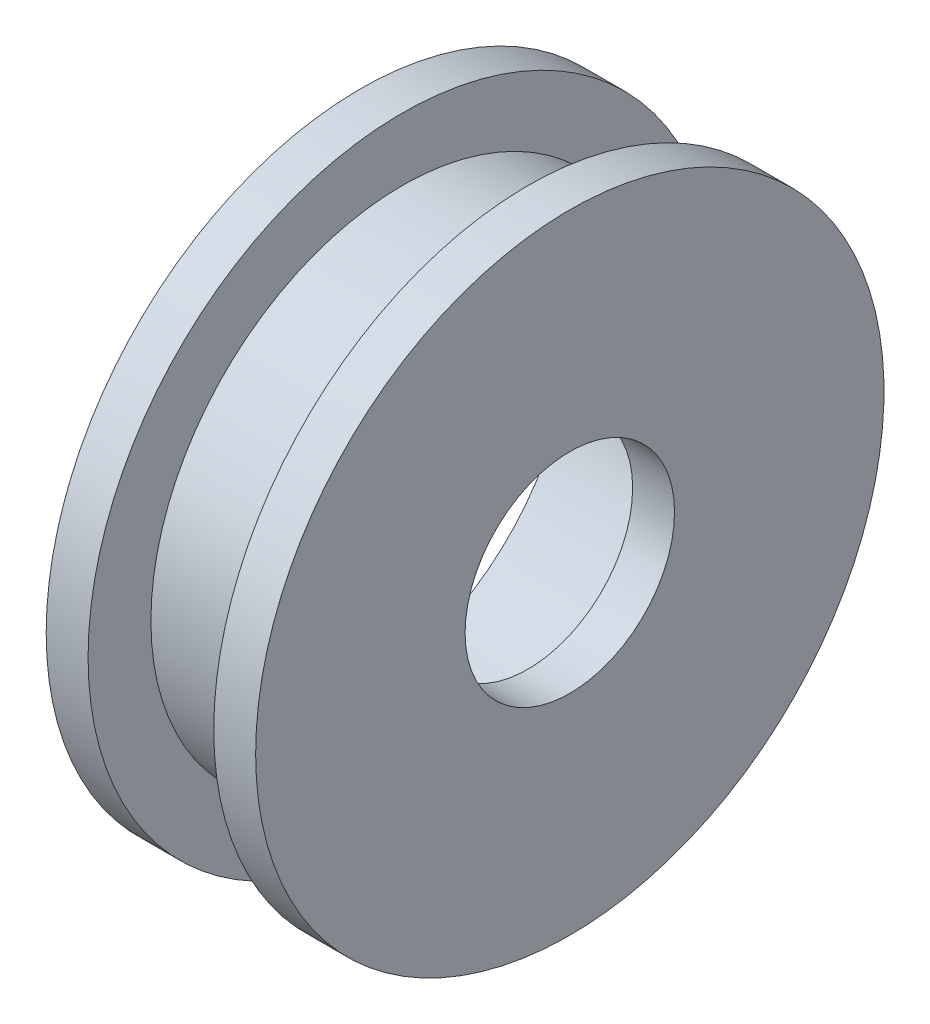
ISO-10303-21;
HEADER;
FILE_DESCRIPTION(('STEP AP214'),'2;1');
FILE_NAME('part.step','',(''),(''),'','','');
FILE_SCHEMA(('AUTOMOTIVE_DESIGN { 1 0 10303 214 1 1 1 1 }'));
ENDSEC;
DATA;
#1=APPLICATION_CONTEXT('core data for automotive mechanical design processes');
#2=APPLICATION_PROTOCOL_DEFINITION('international standard','automotive_design',2000,#1);
#3=PRODUCT_CONTEXT('',#1,'mechanical');
#4=PRODUCT('Part','Part','',(#3));
#5=PRODUCT_RELATED_PRODUCT_CATEGORY('part','',(#4));
#6=PRODUCT_DEFINITION_FORMATION('','',#4);
#7=PRODUCT_DEFINITION_CONTEXT('part definition',#1,'design');
#8=PRODUCT_DEFINITION('design','',#6,#7);
#9=PRODUCT_DEFINITION_SHAPE('','',#8);
#10=(LENGTH_UNIT() NAMED_UNIT(*) SI_UNIT(.MILLI.,.METRE.));
#11=(NAMED_UNIT(*) PLANE_ANGLE_UNIT() SI_UNIT($,.RADIAN.));
#12=(NAMED_UNIT(*) SI_UNIT($,.STERADIAN.) SOLID_ANGLE_UNIT());
#13=UNCERTAINTY_MEASURE_WITH_UNIT(LENGTH_MEASURE(1.E-05),#10,'distance_accuracy_value','');
#14=(GEOMETRIC_REPRESENTATION_CONTEXT(3) GLOBAL_UNCERTAINTY_ASSIGNED_CONTEXT((#13)) GLOBAL_UNIT_ASSIGNED_CONTEXT((#10,
#11,#12)) REPRESENTATION_CONTEXT('',''));
#15=CARTESIAN_POINT('',(0.,0.,0.));
#16=DIRECTION('',(0.,0.,1.));
#17=DIRECTION('',(1.,0.,0.));
#18=AXIS2_PLACEMENT_3D('',#15,#16,#17);
#19=CARTESIAN_POINT('',(0.,0.,0.));
#20=DIRECTION('',(-1.,0.,0.));
#21=DIRECTION('',(0.,0.,1.));
#22=AXIS2_PLACEMENT_3D('',#19,#20,#21);
#23=CYLINDRICAL_SURFACE('',#22,7.5);
#24=CARTESIAN_POINT('',(-4.,0.,0.));
#25=DIRECTION('',(-1.,0.,0.));
#26=DIRECTION('',(0.,0.,1.));
#27=AXIS2_PLACEMENT_3D('',#24,#25,#26);
#28=CIRCLE('',#27,7.5);
#29=CARTESIAN_POINT('',(-4.,0.,7.5));
#30=VERTEX_POINT('',#29);
#31=EDGE_CURVE('E10',#30,#30,#28,.T.);
#32=ORIENTED_EDGE('',*,*,#31,.T.);
#33=EDGE_LOOP('',(#32));
#34=FACE_BOUND('',#33,.T.);
#35=CARTESIAN_POINT('',(-5.,0.,0.));
#36=DIRECTION('',(-1.,0.,0.));
#37=DIRECTION('',(0.,0.,1.));
#38=AXIS2_PLACEMENT_3D('',#35,#36,#37);
#39=CIRCLE('',#38,7.5);
#40=CARTESIAN_POINT('',(-5.,0.,7.5));
#41=VERTEX_POINT('',#40);
#42=EDGE_CURVE('E65',#41,#41,#39,.T.);
#43=ORIENTED_EDGE('',*,*,#42,.F.);
#44=EDGE_LOOP('',(#43));
#45=FACE_BOUND('',#44,.T.);
#46=ADVANCED_FACE('F31',(#34,#45),#23,.T.);
#47=CARTESIAN_POINT('',(-4.,-7.5,0.));
#48=DIRECTION('',(1.,0.,0.));
#49=DIRECTION('',(0.,0.,-1.));
#50=AXIS2_PLACEMENT_3D('',#47,#48,#49);
#51=PLANE('',#50);
#52=CARTESIAN_POINT('',(-4.00000000000001,0.,0.));
#53=DIRECTION('',(-1.,0.,0.));
#54=DIRECTION('',(0.,0.,1.));
#55=AXIS2_PLACEMENT_3D('',#52,#53,#54);
#56=CIRCLE('',#55,6.);
#57=CARTESIAN_POINT('',(-4.00000000000001,0.,6.));
#58=VERTEX_POINT('',#57);
#59=EDGE_CURVE('E37',#58,#58,#56,.T.);
#60=ORIENTED_EDGE('',*,*,#59,.T.);
#61=EDGE_LOOP('',(#60));
#62=FACE_BOUND('',#61,.T.);
#63=ORIENTED_EDGE('',*,*,#31,.F.);
#64=EDGE_LOOP('',(#63));
#65=FACE_BOUND('',#64,.T.);
#66=ADVANCED_FACE('F73',(#62,#65),#51,.T.);
#67=CARTESIAN_POINT('',(0.,0.,0.));
#68=DIRECTION('',(-1.,0.,0.));
#69=DIRECTION('',(0.,0.,1.));
#70=AXIS2_PLACEMENT_3D('',#67,#68,#69);
#71=CYLINDRICAL_SURFACE('',#70,6.);
#72=CARTESIAN_POINT('',(-1.,0.,0.));
#73=DIRECTION('',(-1.,0.,0.));
#74=DIRECTION('',(0.,0.,1.));
#75=AXIS2_PLACEMENT_3D('',#72,#73,#74);
#76=CIRCLE('',#75,6.);
#77=CARTESIAN_POINT('',(-1.,0.,6.));
#78=VERTEX_POINT('',#77);
#79=EDGE_CURVE('E41',#78,#78,#76,.T.);
#80=ORIENTED_EDGE('',*,*,#79,.T.);
#81=EDGE_LOOP('',(#80));
#82=FACE_BOUND('',#81,.T.);
#83=ORIENTED_EDGE('',*,*,#59,.F.);
#84=EDGE_LOOP('',(#83));
#85=FACE_BOUND('',#84,.T.);
#86=ADVANCED_FACE('F77',(#82,#85),#71,.T.);
#87=CARTESIAN_POINT('',(-1.,-6.,0.));
#88=DIRECTION('',(-1.,0.,0.));
#89=DIRECTION('',(0.,0.,1.));
#90=AXIS2_PLACEMENT_3D('',#87,#88,#89);
#91=PLANE('',#90);
#92=CARTESIAN_POINT('',(-1.,0.,0.));
#93=DIRECTION('',(-1.,0.,0.));
#94=DIRECTION('',(0.,0.,1.));
#95=AXIS2_PLACEMENT_3D('',#92,#93,#94);
#96=CIRCLE('',#95,7.5);
#97=CARTESIAN_POINT('',(-1.,0.,7.5));
#98=VERTEX_POINT('',#97);
#99=EDGE_CURVE('E45',#98,#98,#96,.T.);
#100=ORIENTED_EDGE('',*,*,#99,.T.);
#101=EDGE_LOOP('',(#100));
#102=FACE_BOUND('',#101,.T.);
#103=ORIENTED_EDGE('',*,*,#79,.F.);
#104=EDGE_LOOP('',(#103));
#105=FACE_BOUND('',#104,.T.);
#106=ADVANCED_FACE('F81',(#102,#105),#91,.T.);
#107=CARTESIAN_POINT('',(0.,0.,0.));
#108=DIRECTION('',(-1.,0.,0.));
#109=DIRECTION('',(0.,0.,1.));
#110=AXIS2_PLACEMENT_3D('',#107,#108,#109);
#111=CYLINDRICAL_SURFACE('',#110,7.5);
#112=CARTESIAN_POINT('',(0.,0.,0.));
#113=DIRECTION('',(-1.,0.,0.));
#114=DIRECTION('',(0.,0.,1.));
#115=AXIS2_PLACEMENT_3D('',#112,#113,#114);
#116=CIRCLE('',#115,7.5);
#117=CARTESIAN_POINT('',(0.,0.,7.5));
#118=VERTEX_POINT('',#117);
#119=EDGE_CURVE('E50',#118,#118,#116,.T.);
#120=ORIENTED_EDGE('',*,*,#119,.T.);
#121=EDGE_LOOP('',(#120));
#122=FACE_BOUND('',#121,.T.);
#123=ORIENTED_EDGE('',*,*,#99,.F.);
#124=EDGE_LOOP('',(#123));
#125=FACE_BOUND('',#124,.T.);
#126=ADVANCED_FACE('F88',(#122,#125),#111,.T.);
#127=CARTESIAN_POINT('',(0.,-7.5,0.));
#128=DIRECTION('',(1.,0.,0.));
#129=DIRECTION('',(0.,0.,-1.));
#130=AXIS2_PLACEMENT_3D('',#127,#128,#129);
#131=PLANE('',#130);
#132=CARTESIAN_POINT('',(0.,0.,0.));
#133=DIRECTION('',(-1.,0.,0.));
#134=DIRECTION('',(0.,0.,1.));
#135=AXIS2_PLACEMENT_3D('',#132,#133,#134);
#136=CIRCLE('',#135,2.5);
#137=CARTESIAN_POINT('',(0.,0.,2.5));
#138=VERTEX_POINT('',#137);
#139=EDGE_CURVE('E53',#138,#138,#136,.T.);
#140=ORIENTED_EDGE('',*,*,#139,.T.);
#141=EDGE_LOOP('',(#140));
#142=FACE_BOUND('',#141,.T.);
#143=ORIENTED_EDGE('',*,*,#119,.F.);
#144=EDGE_LOOP('',(#143));
#145=FACE_BOUND('',#144,.T.);
#146=ADVANCED_FACE('F92',(#142,#145),#131,.T.);
#147=CARTESIAN_POINT('',(0.,0.,0.));
#148=DIRECTION('',(-1.,0.,0.));
#149=DIRECTION('',(0.,0.,1.));
#150=AXIS2_PLACEMENT_3D('',#147,#148,#149);
#151=CYLINDRICAL_SURFACE('',#150,2.5);
#152=CARTESIAN_POINT('',(-1.,0.,0.));
#153=DIRECTION('',(-1.,0.,0.));
#154=DIRECTION('',(0.,0.,1.));
#155=AXIS2_PLACEMENT_3D('',#152,#153,#154);
#156=CIRCLE('',#155,2.5);
#157=CARTESIAN_POINT('',(-1.,0.,2.5));
#158=VERTEX_POINT('',#157);
#159=EDGE_CURVE('E56',#158,#158,#156,.T.);
#160=ORIENTED_EDGE('',*,*,#159,.T.);
#161=EDGE_LOOP('',(#160));
#162=FACE_BOUND('',#161,.T.);
#163=ORIENTED_EDGE('',*,*,#139,.F.);
#164=EDGE_LOOP('',(#163));
#165=FACE_BOUND('',#164,.T.);
#166=ADVANCED_FACE('F96',(#162,#165),#151,.F.);
#167=CARTESIAN_POINT('',(-1.,-2.5,0.));
#168=DIRECTION('',(-1.,0.,0.));
#169=DIRECTION('',(0.,0.,1.));
#170=AXIS2_PLACEMENT_3D('',#167,#168,#169);
#171=PLANE('',#170);
#172=CARTESIAN_POINT('',(-1.,0.,0.));
#173=DIRECTION('',(-1.,0.,0.));
#174=DIRECTION('',(0.,0.,1.));
#175=AXIS2_PLACEMENT_3D('',#172,#173,#174);
#176=CIRCLE('',#175,5.);
#177=CARTESIAN_POINT('',(-1.,0.,5.));
#178=VERTEX_POINT('',#177);
#179=EDGE_CURVE('E59',#178,#178,#176,.T.);
#180=ORIENTED_EDGE('',*,*,#179,.T.);
#181=EDGE_LOOP('',(#180));
#182=FACE_BOUND('',#181,.T.);
#183=ORIENTED_EDGE('',*,*,#159,.F.);
#184=EDGE_LOOP('',(#183));
#185=FACE_BOUND('',#184,.T.);
#186=ADVANCED_FACE('F100',(#182,#185),#171,.T.);
#187=CARTESIAN_POINT('',(0.,0.,0.));
#188=DIRECTION('',(-1.,0.,0.));
#189=DIRECTION('',(0.,0.,1.));
#190=AXIS2_PLACEMENT_3D('',#187,#188,#189);
#191=CYLINDRICAL_SURFACE('',#190,5.);
#192=CARTESIAN_POINT('',(-5.00000000000001,0.,0.));
#193=DIRECTION('',(-1.,0.,0.));
#194=DIRECTION('',(0.,0.,1.));
#195=AXIS2_PLACEMENT_3D('',#192,#193,#194);
#196=CIRCLE('',#195,5.);
#197=CARTESIAN_POINT('',(-5.00000000000001,0.,5.));
#198=VERTEX_POINT('',#197);
#199=EDGE_CURVE('E62',#198,#198,#196,.T.);
#200=ORIENTED_EDGE('',*,*,#199,.T.);
#201=EDGE_LOOP('',(#200));
#202=FACE_BOUND('',#201,.T.);
#203=ORIENTED_EDGE('',*,*,#179,.F.);
#204=EDGE_LOOP('',(#203));
#205=FACE_BOUND('',#204,.T.);
#206=ADVANCED_FACE('F104',(#202,#205),#191,.F.);
#207=CARTESIAN_POINT('',(-5.,-5.,0.));
#208=DIRECTION('',(-1.,0.,0.));
#209=DIRECTION('',(0.,0.,1.));
#210=AXIS2_PLACEMENT_3D('',#207,#208,#209);
#211=PLANE('',#210);
#212=ORIENTED_EDGE('',*,*,#42,.T.);
#213=EDGE_LOOP('',(#212));
#214=FACE_BOUND('',#213,.T.);
#215=ORIENTED_EDGE('',*,*,#199,.F.);
#216=EDGE_LOOP('',(#215));
#217=FACE_BOUND('',#216,.T.);
#218=ADVANCED_FACE('F69',(#214,#217),#211,.T.);
#219=CLOSED_SHELL('',(#46,#66,#86,#106,#126,#146,#166,#186,#206,#218));
#220=MANIFOLD_SOLID_BREP('B2',#219);
#221=ADVANCED_BREP_SHAPE_REPRESENTATION('',(#18,#220),#14);
#222=SHAPE_DEFINITION_REPRESENTATION(#9,#221);
ENDSEC;
END-ISO-10303-21;
